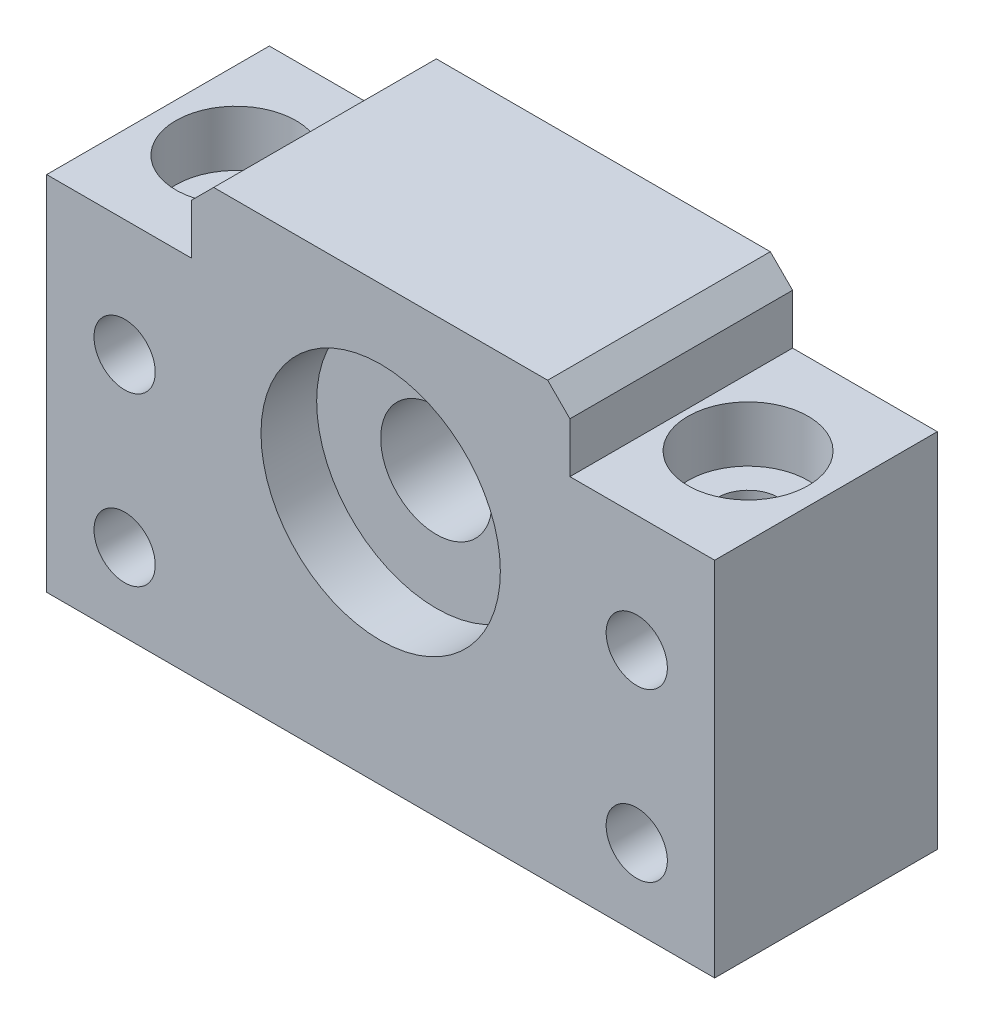
ISO-10303-21;
HEADER;
FILE_DESCRIPTION(('STEP AP214'),'2;1');
FILE_NAME('part.step','',(''),(''),'','','');
FILE_SCHEMA(('AUTOMOTIVE_DESIGN { 1 0 10303 214 1 1 1 1 }'));
ENDSEC;
DATA;
#1=APPLICATION_CONTEXT('core data for automotive mechanical design processes');
#2=APPLICATION_PROTOCOL_DEFINITION('international standard','automotive_design',2000,#1);
#3=PRODUCT_CONTEXT('',#1,'mechanical');
#4=PRODUCT('Part','Part','',(#3));
#5=PRODUCT_RELATED_PRODUCT_CATEGORY('part','',(#4));
#6=PRODUCT_DEFINITION_FORMATION('','',#4);
#7=PRODUCT_DEFINITION_CONTEXT('part definition',#1,'design');
#8=PRODUCT_DEFINITION('design','',#6,#7);
#9=PRODUCT_DEFINITION_SHAPE('','',#8);
#10=(LENGTH_UNIT() NAMED_UNIT(*) SI_UNIT(.MILLI.,.METRE.));
#11=(NAMED_UNIT(*) PLANE_ANGLE_UNIT() SI_UNIT($,.RADIAN.));
#12=(NAMED_UNIT(*) SI_UNIT($,.STERADIAN.) SOLID_ANGLE_UNIT());
#13=UNCERTAINTY_MEASURE_WITH_UNIT(LENGTH_MEASURE(1.E-05),#10,'distance_accuracy_value','');
#14=(GEOMETRIC_REPRESENTATION_CONTEXT(3) GLOBAL_UNCERTAINTY_ASSIGNED_CONTEXT((#13)) GLOBAL_UNIT_ASSIGNED_CONTEXT((#10,
#11,#12)) REPRESENTATION_CONTEXT('',''));
#15=CARTESIAN_POINT('',(0.,0.,0.));
#16=DIRECTION('',(0.,0.,1.));
#17=DIRECTION('',(1.,0.,0.));
#18=AXIS2_PLACEMENT_3D('',#15,#16,#17);
#19=CARTESIAN_POINT('',(0.,0.,5.));
#20=DIRECTION('',(0.,0.,1.));
#21=DIRECTION('',(1.,0.,0.));
#22=AXIS2_PLACEMENT_3D('',#19,#20,#21);
#23=PLANE('',#22);
#24=CARTESIAN_POINT('',(0.,0.,5.));
#25=DIRECTION('',(0.,0.,1.));
#26=DIRECTION('',(1.,0.,0.));
#27=AXIS2_PLACEMENT_3D('',#24,#25,#26);
#28=CIRCLE('',#27,10.75);
#29=CARTESIAN_POINT('',(10.75,0.,5.));
#30=VERTEX_POINT('',#29);
#31=EDGE_CURVE('E11',#30,#30,#28,.T.);
#32=ORIENTED_EDGE('',*,*,#31,.T.);
#33=EDGE_LOOP('',(#32));
#34=FACE_BOUND('',#33,.T.);
#35=CARTESIAN_POINT('',(0.,0.,5.));
#36=DIRECTION('',(0.,0.,1.));
#37=DIRECTION('',(1.,0.,0.));
#38=AXIS2_PLACEMENT_3D('',#35,#36,#37);
#39=CIRCLE('',#38,5.);
#40=CARTESIAN_POINT('',(5.,0.,5.));
#41=VERTEX_POINT('',#40);
#42=EDGE_CURVE('E60',#41,#41,#39,.T.);
#43=ORIENTED_EDGE('',*,*,#42,.F.);
#44=EDGE_LOOP('',(#43));
#45=FACE_BOUND('',#44,.T.);
#46=ADVANCED_FACE('F49',(#34,#45),#23,.T.);
#47=CARTESIAN_POINT('',(0.,0.,-5.));
#48=DIRECTION('',(0.,0.,1.));
#49=DIRECTION('',(1.,0.,0.));
#50=AXIS2_PLACEMENT_3D('',#47,#48,#49);
#51=PLANE('',#50);
#52=CARTESIAN_POINT('',(0.,0.,-5.));
#53=DIRECTION('',(0.,0.,1.));
#54=DIRECTION('',(1.,0.,0.));
#55=AXIS2_PLACEMENT_3D('',#52,#53,#54);
#56=CIRCLE('',#55,10.75);
#57=CARTESIAN_POINT('',(10.75,0.,-5.));
#58=VERTEX_POINT('',#57);
#59=EDGE_CURVE('E53',#58,#58,#56,.T.);
#60=ORIENTED_EDGE('',*,*,#59,.F.);
#61=EDGE_LOOP('',(#60));
#62=FACE_BOUND('',#61,.T.);
#63=CARTESIAN_POINT('',(0.,0.,-5.));
#64=DIRECTION('',(0.,0.,1.));
#65=DIRECTION('',(1.,0.,0.));
#66=AXIS2_PLACEMENT_3D('',#63,#64,#65);
#67=CIRCLE('',#66,5.);
#68=CARTESIAN_POINT('',(5.,0.,-5.));
#69=VERTEX_POINT('',#68);
#70=EDGE_CURVE('E62',#69,#69,#67,.T.);
#71=ORIENTED_EDGE('',*,*,#70,.T.);
#72=EDGE_LOOP('',(#71));
#73=FACE_BOUND('',#72,.T.);
#74=ADVANCED_FACE('F72',(#62,#73),#51,.F.);
#75=CARTESIAN_POINT('',(0.,0.,5.));
#76=DIRECTION('',(0.,0.,-1.));
#77=DIRECTION('',(-1.,0.,0.));
#78=AXIS2_PLACEMENT_3D('',#75,#76,#77);
#79=CYLINDRICAL_SURFACE('',#78,10.75);
#80=ORIENTED_EDGE('',*,*,#31,.F.);
#81=EDGE_LOOP('',(#80));
#82=FACE_BOUND('',#81,.T.);
#83=ORIENTED_EDGE('',*,*,#59,.T.);
#84=EDGE_LOOP('',(#83));
#85=FACE_BOUND('',#84,.T.);
#86=ADVANCED_FACE('F51',(#82,#85),#79,.T.);
#87=CARTESIAN_POINT('',(0.,0.,5.));
#88=DIRECTION('',(0.,0.,-1.));
#89=DIRECTION('',(-1.,0.,0.));
#90=AXIS2_PLACEMENT_3D('',#87,#88,#89);
#91=CYLINDRICAL_SURFACE('',#90,5.);
#92=ORIENTED_EDGE('',*,*,#42,.T.);
#93=EDGE_LOOP('',(#92));
#94=FACE_BOUND('',#93,.T.);
#95=ORIENTED_EDGE('',*,*,#70,.F.);
#96=EDGE_LOOP('',(#95));
#97=FACE_BOUND('',#96,.T.);
#98=ADVANCED_FACE('F68',(#94,#97),#91,.F.);
#99=CLOSED_SHELL('',(#46,#74,#86,#98));
#100=MANIFOLD_SOLID_BREP('B2',#99);
#101=CARTESIAN_POINT('',(23.,17.,0.));
#102=DIRECTION('',(0.,-1.,0.));
#103=DIRECTION('',(1.,0.,0.));
#104=AXIS2_PLACEMENT_3D('',#101,#102,#103);
#105=CYLINDRICAL_SURFACE('',#104,2.75);
#106=CARTESIAN_POINT('',(23.,0.,0.));
#107=DIRECTION('',(0.,-0.707106781186547,-0.707106781186547));
#108=DIRECTION('',(0.,0.707106781186547,-0.707106781186547));
#109=AXIS2_PLACEMENT_3D('',#106,#107,#108);
#110=ELLIPSE('',#109,3.88908729652601,2.75);
#111=CARTESIAN_POINT('',(20.25,0.,0.));
#112=VERTEX_POINT('',#111);
#113=CARTESIAN_POINT('',(25.75,0.,0.));
#114=VERTEX_POINT('',#113);
#115=EDGE_CURVE('E225',#112,#114,#110,.T.);
#116=ORIENTED_EDGE('',*,*,#115,.T.);
#117=CARTESIAN_POINT('',(23.,0.,0.));
#118=DIRECTION('',(0.,0.707106781186547,-0.707106781186547));
#119=DIRECTION('',(0.,-0.707106781186547,-0.707106781186547));
#120=AXIS2_PLACEMENT_3D('',#117,#118,#119);
#121=ELLIPSE('',#120,3.88908729652601,2.75);
#122=EDGE_CURVE('E226',#114,#112,#121,.F.);
#123=ORIENTED_EDGE('',*,*,#122,.T.);
#124=EDGE_LOOP('',(#116,#123));
#125=FACE_BOUND('',#124,.T.);
#126=CARTESIAN_POINT('',(23.,5.49999999999998,0.));
#127=DIRECTION('',(0.,1.,0.));
#128=DIRECTION('',(-1.,0.,0.));
#129=AXIS2_PLACEMENT_3D('',#126,#127,#128);
#130=CIRCLE('',#129,2.75);
#131=CARTESIAN_POINT('',(20.25,5.49999999999998,0.));
#132=VERTEX_POINT('',#131);
#133=EDGE_CURVE('E115',#132,#132,#130,.F.);
#134=ORIENTED_EDGE('',*,*,#133,.F.);
#135=EDGE_LOOP('',(#134));
#136=FACE_BOUND('',#135,.T.);
#137=ADVANCED_FACE('F111',(#125,#136),#105,.F.);
#138=CARTESIAN_POINT('',(-23.,17.,0.));
#139=DIRECTION('',(0.,-1.,0.));
#140=DIRECTION('',(1.,0.,0.));
#141=AXIS2_PLACEMENT_3D('',#138,#139,#140);
#142=CYLINDRICAL_SURFACE('',#141,2.75);
#143=CARTESIAN_POINT('',(-23.,0.,0.));
#144=DIRECTION('',(0.,-0.707106781186547,-0.707106781186547));
#145=DIRECTION('',(0.,0.707106781186547,-0.707106781186547));
#146=AXIS2_PLACEMENT_3D('',#143,#144,#145);
#147=ELLIPSE('',#146,3.88908729652601,2.75);
#148=CARTESIAN_POINT('',(-25.75,0.,0.));
#149=VERTEX_POINT('',#148);
#150=CARTESIAN_POINT('',(-20.25,0.,0.));
#151=VERTEX_POINT('',#150);
#152=EDGE_CURVE('E304',#149,#151,#147,.T.);
#153=ORIENTED_EDGE('',*,*,#152,.T.);
#154=CARTESIAN_POINT('',(-23.,0.,0.));
#155=DIRECTION('',(0.,0.707106781186547,-0.707106781186547));
#156=DIRECTION('',(0.,-0.707106781186547,-0.707106781186547));
#157=AXIS2_PLACEMENT_3D('',#154,#155,#156);
#158=ELLIPSE('',#157,3.88908729652601,2.75);
#159=EDGE_CURVE('E128',#151,#149,#158,.F.);
#160=ORIENTED_EDGE('',*,*,#159,.T.);
#161=EDGE_LOOP('',(#153,#160));
#162=FACE_BOUND('',#161,.T.);
#163=CARTESIAN_POINT('',(-23.,5.49999999999999,0.));
#164=DIRECTION('',(0.,1.,0.));
#165=DIRECTION('',(-1.,0.,0.));
#166=AXIS2_PLACEMENT_3D('',#163,#164,#165);
#167=CIRCLE('',#166,2.75);
#168=CARTESIAN_POINT('',(-25.75,5.49999999999999,0.));
#169=VERTEX_POINT('',#168);
#170=EDGE_CURVE('E250',#169,#169,#167,.F.);
#171=ORIENTED_EDGE('',*,*,#170,.F.);
#172=EDGE_LOOP('',(#171));
#173=FACE_BOUND('',#172,.T.);
#174=ADVANCED_FACE('F515',(#162,#173),#142,.F.);
#175=CARTESIAN_POINT('',(-23.,0.,10.));
#176=DIRECTION('',(0.,0.,-1.));
#177=DIRECTION('',(-1.,0.,0.));
#178=AXIS2_PLACEMENT_3D('',#175,#176,#177);
#179=CYLINDRICAL_SURFACE('',#178,2.75);
#180=CARTESIAN_POINT('',(-23.,0.,0.));
#181=DIRECTION('',(0.,-0.707106781186547,-0.707106781186547));
#182=DIRECTION('',(0.,0.707106781186547,-0.707106781186547));
#183=AXIS2_PLACEMENT_3D('',#180,#181,#182);
#184=ELLIPSE('',#183,3.88908729652601,2.75);
#185=EDGE_CURVE('E307',#149,#151,#184,.F.);
#186=ORIENTED_EDGE('',*,*,#185,.F.);
#187=ORIENTED_EDGE('',*,*,#159,.F.);
#188=EDGE_LOOP('',(#186,#187));
#189=FACE_BOUND('',#188,.T.);
#190=CARTESIAN_POINT('',(-23.,0.,10.));
#191=DIRECTION('',(0.,0.,1.));
#192=DIRECTION('',(1.,0.,0.));
#193=AXIS2_PLACEMENT_3D('',#190,#191,#192);
#194=CIRCLE('',#193,2.75);
#195=CARTESIAN_POINT('',(-20.25,0.,10.));
#196=VERTEX_POINT('',#195);
#197=EDGE_CURVE('E336',#196,#196,#194,.T.);
#198=ORIENTED_EDGE('',*,*,#197,.T.);
#199=EDGE_LOOP('',(#198));
#200=FACE_BOUND('',#199,.T.);
#201=ADVANCED_FACE('F521',(#189,#200),#179,.F.);
#202=CARTESIAN_POINT('',(-23.,-15.,10.));
#203=DIRECTION('',(0.,0.,-1.));
#204=DIRECTION('',(-1.,0.,0.));
#205=AXIS2_PLACEMENT_3D('',#202,#203,#204);
#206=CYLINDRICAL_SURFACE('',#205,2.75);
#207=CARTESIAN_POINT('',(-23.,-15.,0.));
#208=DIRECTION('',(0.,-0.707106781186547,-0.707106781186547));
#209=DIRECTION('',(0.,0.707106781186547,-0.707106781186547));
#210=AXIS2_PLACEMENT_3D('',#207,#208,#209);
#211=ELLIPSE('',#210,3.88908729652601,2.75);
#212=CARTESIAN_POINT('',(-25.75,-15.,0.));
#213=VERTEX_POINT('',#212);
#214=CARTESIAN_POINT('',(-20.25,-15.,0.));
#215=VERTEX_POINT('',#214);
#216=EDGE_CURVE('E47',#213,#215,#211,.F.);
#217=ORIENTED_EDGE('',*,*,#216,.F.);
#218=CARTESIAN_POINT('',(-23.,-15.,0.));
#219=DIRECTION('',(0.,0.707106781186547,-0.707106781186547));
#220=DIRECTION('',(0.,-0.707106781186547,-0.707106781186547));
#221=AXIS2_PLACEMENT_3D('',#218,#219,#220);
#222=ELLIPSE('',#221,3.88908729652601,2.75);
#223=EDGE_CURVE('E135',#215,#213,#222,.F.);
#224=ORIENTED_EDGE('',*,*,#223,.F.);
#225=EDGE_LOOP('',(#217,#224));
#226=FACE_BOUND('',#225,.T.);
#227=CARTESIAN_POINT('',(-23.,-15.,10.));
#228=DIRECTION('',(0.,0.,1.));
#229=DIRECTION('',(1.,0.,0.));
#230=AXIS2_PLACEMENT_3D('',#227,#228,#229);
#231=CIRCLE('',#230,2.75);
#232=CARTESIAN_POINT('',(-20.25,-15.,10.));
#233=VERTEX_POINT('',#232);
#234=EDGE_CURVE('E328',#233,#233,#231,.T.);
#235=ORIENTED_EDGE('',*,*,#234,.T.);
#236=EDGE_LOOP('',(#235));
#237=FACE_BOUND('',#236,.T.);
#238=ADVANCED_FACE('F572',(#226,#237),#206,.F.);
#239=CARTESIAN_POINT('',(23.,-15.,10.));
#240=DIRECTION('',(0.,0.,-1.));
#241=DIRECTION('',(-1.,0.,0.));
#242=AXIS2_PLACEMENT_3D('',#239,#240,#241);
#243=CYLINDRICAL_SURFACE('',#242,2.75);
#244=CARTESIAN_POINT('',(23.,-15.,0.));
#245=DIRECTION('',(0.,-0.707106781186547,-0.707106781186547));
#246=DIRECTION('',(0.,0.707106781186547,-0.707106781186547));
#247=AXIS2_PLACEMENT_3D('',#244,#245,#246);
#248=ELLIPSE('',#247,3.88908729652601,2.75);
#249=CARTESIAN_POINT('',(20.25,-15.,0.));
#250=VERTEX_POINT('',#249);
#251=CARTESIAN_POINT('',(25.75,-15.,0.));
#252=VERTEX_POINT('',#251);
#253=EDGE_CURVE('E295',#250,#252,#248,.F.);
#254=ORIENTED_EDGE('',*,*,#253,.F.);
#255=CARTESIAN_POINT('',(23.,-15.,0.));
#256=DIRECTION('',(0.,0.707106781186547,-0.707106781186547));
#257=DIRECTION('',(0.,-0.707106781186547,-0.707106781186547));
#258=AXIS2_PLACEMENT_3D('',#255,#256,#257);
#259=ELLIPSE('',#258,3.88908729652601,2.75);
#260=EDGE_CURVE('E281',#252,#250,#259,.F.);
#261=ORIENTED_EDGE('',*,*,#260,.F.);
#262=EDGE_LOOP('',(#254,#261));
#263=FACE_BOUND('',#262,.T.);
#264=CARTESIAN_POINT('',(23.,-15.,10.));
#265=DIRECTION('',(0.,0.,1.));
#266=DIRECTION('',(-1.,0.,0.));
#267=AXIS2_PLACEMENT_3D('',#264,#265,#266);
#268=CIRCLE('',#267,2.75);
#269=CARTESIAN_POINT('',(20.25,-15.,10.));
#270=VERTEX_POINT('',#269);
#271=EDGE_CURVE('E320',#270,#270,#268,.T.);
#272=ORIENTED_EDGE('',*,*,#271,.T.);
#273=EDGE_LOOP('',(#272));
#274=FACE_BOUND('',#273,.T.);
#275=ADVANCED_FACE('F575',(#263,#274),#243,.F.);
#276=CARTESIAN_POINT('',(23.,0.,10.));
#277=DIRECTION('',(0.,0.,-1.));
#278=DIRECTION('',(-1.,0.,0.));
#279=AXIS2_PLACEMENT_3D('',#276,#277,#278);
#280=CYLINDRICAL_SURFACE('',#279,2.75);
#281=CARTESIAN_POINT('',(23.,0.,0.));
#282=DIRECTION('',(0.,-0.707106781186547,-0.707106781186547));
#283=DIRECTION('',(0.,0.707106781186547,-0.707106781186547));
#284=AXIS2_PLACEMENT_3D('',#281,#282,#283);
#285=ELLIPSE('',#284,3.88908729652601,2.75);
#286=EDGE_CURVE('E221',#112,#114,#285,.F.);
#287=ORIENTED_EDGE('',*,*,#286,.F.);
#288=ORIENTED_EDGE('',*,*,#122,.F.);
#289=EDGE_LOOP('',(#287,#288));
#290=FACE_BOUND('',#289,.T.);
#291=CARTESIAN_POINT('',(23.,0.,10.));
#292=DIRECTION('',(0.,0.,1.));
#293=DIRECTION('',(-1.,0.,0.));
#294=AXIS2_PLACEMENT_3D('',#291,#292,#293);
#295=CIRCLE('',#294,2.75);
#296=CARTESIAN_POINT('',(20.25,0.,10.));
#297=VERTEX_POINT('',#296);
#298=EDGE_CURVE('E312',#297,#297,#295,.T.);
#299=ORIENTED_EDGE('',*,*,#298,.T.);
#300=EDGE_LOOP('',(#299));
#301=FACE_BOUND('',#300,.T.);
#302=ADVANCED_FACE('F235',(#290,#301),#280,.F.);
#303=CARTESIAN_POINT('',(0.,0.,10.));
#304=DIRECTION('',(0.,0.,-1.));
#305=DIRECTION('',(-1.,0.,0.));
#306=AXIS2_PLACEMENT_3D('',#303,#304,#305);
#307=PLANE('',#306);
#308=DIRECTION('',(-0.707106781186551,0.707106781186543,0.));
#309=VECTOR('',#308,1.);
#310=CARTESIAN_POINT('',(15.,17.,10.));
#311=LINE('',#310,#309);
#312=CARTESIAN_POINT('',(17.,15.,10.));
#313=VERTEX_POINT('',#312);
#314=CARTESIAN_POINT('',(15.,17.,10.));
#315=VERTEX_POINT('',#314);
#316=EDGE_CURVE('E352',#313,#315,#311,.T.);
#317=ORIENTED_EDGE('',*,*,#316,.T.);
#318=DIRECTION('',(-1.,0.,0.));
#319=VECTOR('',#318,1.);
#320=CARTESIAN_POINT('',(15.,17.,10.));
#321=LINE('',#320,#319);
#322=CARTESIAN_POINT('',(-15.,17.,10.));
#323=VERTEX_POINT('',#322);
#324=EDGE_CURVE('E356',#315,#323,#321,.T.);
#325=ORIENTED_EDGE('',*,*,#324,.T.);
#326=DIRECTION('',(-0.707106781186551,-0.707106781186544,0.));
#327=VECTOR('',#326,1.);
#328=CARTESIAN_POINT('',(-15.,17.,10.));
#329=LINE('',#328,#327);
#330=CARTESIAN_POINT('',(-17.,15.,10.));
#331=VERTEX_POINT('',#330);
#332=EDGE_CURVE('E360',#323,#331,#329,.T.);
#333=ORIENTED_EDGE('',*,*,#332,.T.);
#334=DIRECTION('',(0.,-1.,0.));
#335=VECTOR('',#334,1.);
#336=CARTESIAN_POINT('',(-17.,15.,10.));
#337=LINE('',#336,#335);
#338=CARTESIAN_POINT('',(-17.,10.5,10.));
#339=VERTEX_POINT('',#338);
#340=EDGE_CURVE('E363',#331,#339,#337,.T.);
#341=ORIENTED_EDGE('',*,*,#340,.T.);
#342=DIRECTION('',(-1.,0.,0.));
#343=VECTOR('',#342,1.);
#344=CARTESIAN_POINT('',(-17.,10.5,10.));
#345=LINE('',#344,#343);
#346=CARTESIAN_POINT('',(-30.,10.5,10.));
#347=VERTEX_POINT('',#346);
#348=EDGE_CURVE('E366',#339,#347,#345,.T.);
#349=ORIENTED_EDGE('',*,*,#348,.T.);
#350=DIRECTION('',(0.,-1.,0.));
#351=VECTOR('',#350,1.);
#352=CARTESIAN_POINT('',(-30.,10.5,10.));
#353=LINE('',#352,#351);
#354=CARTESIAN_POINT('',(-30.,-22.,10.));
#355=VERTEX_POINT('',#354);
#356=EDGE_CURVE('E369',#347,#355,#353,.T.);
#357=ORIENTED_EDGE('',*,*,#356,.T.);
#358=DIRECTION('',(1.,0.,0.));
#359=VECTOR('',#358,1.);
#360=CARTESIAN_POINT('',(-30.,-22.,10.));
#361=LINE('',#360,#359);
#362=CARTESIAN_POINT('',(30.,-22.,10.));
#363=VERTEX_POINT('',#362);
#364=EDGE_CURVE('E372',#355,#363,#361,.T.);
#365=ORIENTED_EDGE('',*,*,#364,.T.);
#366=DIRECTION('',(0.,1.,0.));
#367=VECTOR('',#366,1.);
#368=CARTESIAN_POINT('',(30.,10.5,10.));
#369=LINE('',#368,#367);
#370=CARTESIAN_POINT('',(30.,10.5,10.));
#371=VERTEX_POINT('',#370);
#372=EDGE_CURVE('E375',#363,#371,#369,.T.);
#373=ORIENTED_EDGE('',*,*,#372,.T.);
#374=DIRECTION('',(-1.,0.,0.));
#375=VECTOR('',#374,1.);
#376=CARTESIAN_POINT('',(17.,10.5,10.));
#377=LINE('',#376,#375);
#378=CARTESIAN_POINT('',(17.,10.5,10.));
#379=VERTEX_POINT('',#378);
#380=EDGE_CURVE('E378',#371,#379,#377,.T.);
#381=ORIENTED_EDGE('',*,*,#380,.T.);
#382=DIRECTION('',(0.,1.,0.));
#383=VECTOR('',#382,1.);
#384=CARTESIAN_POINT('',(17.,15.,10.));
#385=LINE('',#384,#383);
#386=EDGE_CURVE('E381',#379,#313,#385,.T.);
#387=ORIENTED_EDGE('',*,*,#386,.T.);
#388=EDGE_LOOP('',(#317,#325,#333,#341,#349,#357,#365,#373,#381,#387));
#389=FACE_BOUND('',#388,.T.);
#390=CARTESIAN_POINT('',(0.,0.,10.));
#391=DIRECTION('',(0.,0.,1.));
#392=DIRECTION('',(1.,0.,0.));
#393=AXIS2_PLACEMENT_3D('',#390,#391,#392);
#394=CIRCLE('',#393,10.75);
#395=CARTESIAN_POINT('',(10.75,0.,10.));
#396=VERTEX_POINT('',#395);
#397=EDGE_CURVE('E344',#396,#396,#394,.T.);
#398=ORIENTED_EDGE('',*,*,#397,.F.);
#399=EDGE_LOOP('',(#398));
#400=FACE_BOUND('',#399,.T.);
#401=ORIENTED_EDGE('',*,*,#197,.F.);
#402=EDGE_LOOP('',(#401));
#403=FACE_BOUND('',#402,.T.);
#404=ORIENTED_EDGE('',*,*,#234,.F.);
#405=EDGE_LOOP('',(#404));
#406=FACE_BOUND('',#405,.T.);
#407=ORIENTED_EDGE('',*,*,#271,.F.);
#408=EDGE_LOOP('',(#407));
#409=FACE_BOUND('',#408,.T.);
#410=ORIENTED_EDGE('',*,*,#298,.F.);
#411=EDGE_LOOP('',(#410));
#412=FACE_BOUND('',#411,.T.);
#413=ADVANCED_FACE('F477',(#389,#400,#403,#406,#409,#412),#307,.F.);
#414=CARTESIAN_POINT('',(0.,0.,-10.));
#415=DIRECTION('',(0.,0.,-1.));
#416=DIRECTION('',(-1.,0.,0.));
#417=AXIS2_PLACEMENT_3D('',#414,#415,#416);
#418=PLANE('',#417);
#419=CARTESIAN_POINT('',(23.,-15.,-10.));
#420=DIRECTION('',(0.,0.,1.));
#421=DIRECTION('',(-1.,0.,0.));
#422=AXIS2_PLACEMENT_3D('',#419,#420,#421);
#423=CIRCLE('',#422,2.75);
#424=CARTESIAN_POINT('',(20.25,-15.,-10.));
#425=VERTEX_POINT('',#424);
#426=EDGE_CURVE('E316',#425,#425,#423,.T.);
#427=ORIENTED_EDGE('',*,*,#426,.T.);
#428=EDGE_LOOP('',(#427));
#429=FACE_BOUND('',#428,.T.);
#430=CARTESIAN_POINT('',(-23.,0.,-10.));
#431=DIRECTION('',(0.,0.,1.));
#432=DIRECTION('',(1.,0.,0.));
#433=AXIS2_PLACEMENT_3D('',#430,#431,#432);
#434=CIRCLE('',#433,2.75);
#435=CARTESIAN_POINT('',(-20.25,0.,-10.));
#436=VERTEX_POINT('',#435);
#437=EDGE_CURVE('E332',#436,#436,#434,.T.);
#438=ORIENTED_EDGE('',*,*,#437,.T.);
#439=EDGE_LOOP('',(#438));
#440=FACE_BOUND('',#439,.T.);
#441=DIRECTION('',(-0.707106781186551,0.707106781186543,0.));
#442=VECTOR('',#441,1.);
#443=CARTESIAN_POINT('',(15.,17.,-10.));
#444=LINE('',#443,#442);
#445=CARTESIAN_POINT('',(17.,15.,-10.));
#446=VERTEX_POINT('',#445);
#447=CARTESIAN_POINT('',(15.,17.,-10.));
#448=VERTEX_POINT('',#447);
#449=EDGE_CURVE('E348',#446,#448,#444,.T.);
#450=ORIENTED_EDGE('',*,*,#449,.F.);
#451=DIRECTION('',(0.,1.,0.));
#452=VECTOR('',#451,1.);
#453=CARTESIAN_POINT('',(17.,15.,-10.));
#454=LINE('',#453,#452);
#455=CARTESIAN_POINT('',(17.,10.5,-10.));
#456=VERTEX_POINT('',#455);
#457=EDGE_CURVE('E357',#456,#446,#454,.T.);
#458=ORIENTED_EDGE('',*,*,#457,.F.);
#459=DIRECTION('',(-1.,0.,0.));
#460=VECTOR('',#459,1.);
#461=CARTESIAN_POINT('',(17.,10.5,-10.));
#462=LINE('',#461,#460);
#463=CARTESIAN_POINT('',(30.,10.5,-10.));
#464=VERTEX_POINT('',#463);
#465=EDGE_CURVE('E409',#464,#456,#462,.T.);
#466=ORIENTED_EDGE('',*,*,#465,.F.);
#467=DIRECTION('',(0.,1.,0.));
#468=VECTOR('',#467,1.);
#469=CARTESIAN_POINT('',(30.,10.5,-10.));
#470=LINE('',#469,#468);
#471=CARTESIAN_POINT('',(30.,-22.,-10.));
#472=VERTEX_POINT('',#471);
#473=EDGE_CURVE('E406',#472,#464,#470,.T.);
#474=ORIENTED_EDGE('',*,*,#473,.F.);
#475=DIRECTION('',(1.,0.,0.));
#476=VECTOR('',#475,1.);
#477=CARTESIAN_POINT('',(-30.,-22.,-10.));
#478=LINE('',#477,#476);
#479=CARTESIAN_POINT('',(-30.,-22.,-10.));
#480=VERTEX_POINT('',#479);
#481=EDGE_CURVE('E403',#480,#472,#478,.T.);
#482=ORIENTED_EDGE('',*,*,#481,.F.);
#483=DIRECTION('',(0.,-1.,0.));
#484=VECTOR('',#483,1.);
#485=CARTESIAN_POINT('',(-30.,10.5,-10.));
#486=LINE('',#485,#484);
#487=CARTESIAN_POINT('',(-30.,10.5,-10.));
#488=VERTEX_POINT('',#487);
#489=EDGE_CURVE('E400',#488,#480,#486,.T.);
#490=ORIENTED_EDGE('',*,*,#489,.F.);
#491=DIRECTION('',(-1.,0.,0.));
#492=VECTOR('',#491,1.);
#493=CARTESIAN_POINT('',(-17.,10.5,-10.));
#494=LINE('',#493,#492);
#495=CARTESIAN_POINT('',(-17.,10.5,-10.));
#496=VERTEX_POINT('',#495);
#497=EDGE_CURVE('E397',#496,#488,#494,.T.);
#498=ORIENTED_EDGE('',*,*,#497,.F.);
#499=DIRECTION('',(0.,-1.,0.));
#500=VECTOR('',#499,1.);
#501=CARTESIAN_POINT('',(-17.,15.,-10.));
#502=LINE('',#501,#500);
#503=CARTESIAN_POINT('',(-17.,15.,-10.));
#504=VERTEX_POINT('',#503);
#505=EDGE_CURVE('E394',#504,#496,#502,.T.);
#506=ORIENTED_EDGE('',*,*,#505,.F.);
#507=DIRECTION('',(-0.707106781186551,-0.707106781186544,0.));
#508=VECTOR('',#507,1.);
#509=CARTESIAN_POINT('',(-15.,17.,-10.));
#510=LINE('',#509,#508);
#511=CARTESIAN_POINT('',(-15.,17.,-10.));
#512=VERTEX_POINT('',#511);
#513=EDGE_CURVE('E391',#512,#504,#510,.T.);
#514=ORIENTED_EDGE('',*,*,#513,.F.);
#515=DIRECTION('',(-1.,0.,0.));
#516=VECTOR('',#515,1.);
#517=CARTESIAN_POINT('',(15.,17.,-10.));
#518=LINE('',#517,#516);
#519=EDGE_CURVE('E388',#448,#512,#518,.T.);
#520=ORIENTED_EDGE('',*,*,#519,.F.);
#521=EDGE_LOOP('',(#450,#458,#466,#474,#482,#490,#498,#506,#514,#520));
#522=FACE_BOUND('',#521,.T.);
#523=CARTESIAN_POINT('',(0.,0.,-10.));
#524=DIRECTION('',(0.,0.,1.));
#525=DIRECTION('',(1.,0.,0.));
#526=AXIS2_PLACEMENT_3D('',#523,#524,#525);
#527=CIRCLE('',#526,10.75);
#528=CARTESIAN_POINT('',(10.75,0.,-10.));
#529=VERTEX_POINT('',#528);
#530=EDGE_CURVE('E340',#529,#529,#527,.T.);
#531=ORIENTED_EDGE('',*,*,#530,.T.);
#532=EDGE_LOOP('',(#531));
#533=FACE_BOUND('',#532,.T.);
#534=CARTESIAN_POINT('',(-23.,-15.,-10.));
#535=DIRECTION('',(0.,0.,1.));
#536=DIRECTION('',(1.,0.,0.));
#537=AXIS2_PLACEMENT_3D('',#534,#535,#536);
#538=CIRCLE('',#537,2.75);
#539=CARTESIAN_POINT('',(-20.25,-15.,-10.));
#540=VERTEX_POINT('',#539);
#541=EDGE_CURVE('E324',#540,#540,#538,.T.);
#542=ORIENTED_EDGE('',*,*,#541,.T.);
#543=EDGE_LOOP('',(#542));
#544=FACE_BOUND('',#543,.T.);
#545=CARTESIAN_POINT('',(23.,0.,-10.));
#546=DIRECTION('',(0.,0.,1.));
#547=DIRECTION('',(-1.,0.,0.));
#548=AXIS2_PLACEMENT_3D('',#545,#546,#547);
#549=CIRCLE('',#548,2.75);
#550=CARTESIAN_POINT('',(20.25,0.,-10.));
#551=VERTEX_POINT('',#550);
#552=EDGE_CURVE('E311',#551,#551,#549,.T.);
#553=ORIENTED_EDGE('',*,*,#552,.T.);
#554=EDGE_LOOP('',(#553));
#555=FACE_BOUND('',#554,.T.);
#556=ADVANCED_FACE('F461',(#429,#440,#522,#533,#544,#555),#418,.T.);
#557=CARTESIAN_POINT('',(15.,17.,10.));
#558=DIRECTION('',(-0.707106781186544,-0.707106781186552,0.));
#559=DIRECTION('',(0.707106781186552,-0.707106781186544,0.));
#560=AXIS2_PLACEMENT_3D('',#557,#558,#559);
#561=PLANE('',#560);
#562=ORIENTED_EDGE('',*,*,#449,.T.);
#563=DIRECTION('',(0.,0.,-1.));
#564=VECTOR('',#563,1.);
#565=CARTESIAN_POINT('',(15.,17.,10.));
#566=LINE('',#565,#564);
#567=EDGE_CURVE('E233',#315,#448,#566,.T.);
#568=ORIENTED_EDGE('',*,*,#567,.F.);
#569=ORIENTED_EDGE('',*,*,#316,.F.);
#570=DIRECTION('',(0.,0.,-1.));
#571=VECTOR('',#570,1.);
#572=CARTESIAN_POINT('',(17.,15.,10.));
#573=LINE('',#572,#571);
#574=EDGE_CURVE('E384',#313,#446,#573,.T.);
#575=ORIENTED_EDGE('',*,*,#574,.T.);
#576=EDGE_LOOP('',(#562,#568,#569,#575));
#577=FACE_BOUND('',#576,.T.);
#578=ADVANCED_FACE('F113',(#577),#561,.F.);
#579=CARTESIAN_POINT('',(15.,17.,10.));
#580=DIRECTION('',(0.,-1.,0.));
#581=DIRECTION('',(0.,0.,-1.));
#582=AXIS2_PLACEMENT_3D('',#579,#580,#581);
#583=PLANE('',#582);
#584=ORIENTED_EDGE('',*,*,#519,.T.);
#585=DIRECTION('',(0.,0.,-1.));
#586=VECTOR('',#585,1.);
#587=CARTESIAN_POINT('',(-15.,17.,10.));
#588=LINE('',#587,#586);
#589=EDGE_CURVE('E445',#323,#512,#588,.T.);
#590=ORIENTED_EDGE('',*,*,#589,.F.);
#591=ORIENTED_EDGE('',*,*,#324,.F.);
#592=ORIENTED_EDGE('',*,*,#567,.T.);
#593=EDGE_LOOP('',(#584,#590,#591,#592));
#594=FACE_BOUND('',#593,.T.);
#595=ADVANCED_FACE('F453',(#594),#583,.F.);
#596=CARTESIAN_POINT('',(-15.,17.,10.));
#597=DIRECTION('',(0.707106781186544,-0.707106781186551,0.));
#598=DIRECTION('',(0.707106781186551,0.707106781186544,0.));
#599=AXIS2_PLACEMENT_3D('',#596,#597,#598);
#600=PLANE('',#599);
#601=ORIENTED_EDGE('',*,*,#513,.T.);
#602=DIRECTION('',(0.,0.,-1.));
#603=VECTOR('',#602,1.);
#604=CARTESIAN_POINT('',(-17.,15.,10.));
#605=LINE('',#604,#603);
#606=EDGE_CURVE('E441',#331,#504,#605,.T.);
#607=ORIENTED_EDGE('',*,*,#606,.F.);
#608=ORIENTED_EDGE('',*,*,#332,.F.);
#609=ORIENTED_EDGE('',*,*,#589,.T.);
#610=EDGE_LOOP('',(#601,#607,#608,#609));
#611=FACE_BOUND('',#610,.T.);
#612=ADVANCED_FACE('F469',(#611),#600,.F.);
#613=CARTESIAN_POINT('',(-17.,15.,10.));
#614=DIRECTION('',(1.,0.,0.));
#615=DIRECTION('',(0.,0.,-1.));
#616=AXIS2_PLACEMENT_3D('',#613,#614,#615);
#617=PLANE('',#616);
#618=ORIENTED_EDGE('',*,*,#505,.T.);
#619=DIRECTION('',(0.,0.,-1.));
#620=VECTOR('',#619,1.);
#621=CARTESIAN_POINT('',(-17.,10.5,10.));
#622=LINE('',#621,#620);
#623=EDGE_CURVE('E437',#339,#496,#622,.T.);
#624=ORIENTED_EDGE('',*,*,#623,.F.);
#625=ORIENTED_EDGE('',*,*,#340,.F.);
#626=ORIENTED_EDGE('',*,*,#606,.T.);
#627=EDGE_LOOP('',(#618,#624,#625,#626));
#628=FACE_BOUND('',#627,.T.);
#629=ADVANCED_FACE('F473',(#628),#617,.F.);
#630=CARTESIAN_POINT('',(-17.,10.5,10.));
#631=DIRECTION('',(0.,-1.,0.));
#632=DIRECTION('',(1.,0.,0.));
#633=AXIS2_PLACEMENT_3D('',#630,#631,#632);
#634=PLANE('',#633);
#635=CARTESIAN_POINT('',(-23.,10.5,0.));
#636=DIRECTION('',(0.,1.,0.));
#637=DIRECTION('',(-1.,0.,0.));
#638=AXIS2_PLACEMENT_3D('',#635,#636,#637);
#639=CIRCLE('',#638,5.4);
#640=CARTESIAN_POINT('',(-28.4,10.5,0.));
#641=VERTEX_POINT('',#640);
#642=EDGE_CURVE('E261',#641,#641,#639,.T.);
#643=ORIENTED_EDGE('',*,*,#642,.F.);
#644=EDGE_LOOP('',(#643));
#645=FACE_BOUND('',#644,.T.);
#646=ORIENTED_EDGE('',*,*,#497,.T.);
#647=DIRECTION('',(0.,0.,-1.));
#648=VECTOR('',#647,1.);
#649=CARTESIAN_POINT('',(-30.,10.5,10.));
#650=LINE('',#649,#648);
#651=EDGE_CURVE('E433',#347,#488,#650,.T.);
#652=ORIENTED_EDGE('',*,*,#651,.F.);
#653=ORIENTED_EDGE('',*,*,#348,.F.);
#654=ORIENTED_EDGE('',*,*,#623,.T.);
#655=EDGE_LOOP('',(#646,#652,#653,#654));
#656=FACE_BOUND('',#655,.T.);
#657=ADVANCED_FACE('F503',(#645,#656),#634,.F.);
#658=CARTESIAN_POINT('',(-30.,10.5,10.));
#659=DIRECTION('',(1.,0.,0.));
#660=DIRECTION('',(0.,1.,0.));
#661=AXIS2_PLACEMENT_3D('',#658,#659,#660);
#662=PLANE('',#661);
#663=ORIENTED_EDGE('',*,*,#489,.T.);
#664=DIRECTION('',(0.,0.,-1.));
#665=VECTOR('',#664,1.);
#666=CARTESIAN_POINT('',(-30.,-22.,10.));
#667=LINE('',#666,#665);
#668=EDGE_CURVE('E429',#355,#480,#667,.T.);
#669=ORIENTED_EDGE('',*,*,#668,.F.);
#670=ORIENTED_EDGE('',*,*,#356,.F.);
#671=ORIENTED_EDGE('',*,*,#651,.T.);
#672=EDGE_LOOP('',(#663,#669,#670,#671));
#673=FACE_BOUND('',#672,.T.);
#674=ADVANCED_FACE('F501',(#673),#662,.F.);
#675=CARTESIAN_POINT('',(-30.,-22.,10.));
#676=DIRECTION('',(0.,1.,0.));
#677=DIRECTION('',(-1.,0.,0.));
#678=AXIS2_PLACEMENT_3D('',#675,#676,#677);
#679=PLANE('',#678);
#680=CARTESIAN_POINT('',(-23.,-22.,0.));
#681=DIRECTION('',(0.,-1.,0.));
#682=DIRECTION('',(1.,0.,0.));
#683=AXIS2_PLACEMENT_3D('',#680,#681,#682);
#684=CIRCLE('',#683,2.75);
#685=CARTESIAN_POINT('',(-20.25,-22.,0.));
#686=VERTEX_POINT('',#685);
#687=EDGE_CURVE('E277',#686,#686,#684,.T.);
#688=ORIENTED_EDGE('',*,*,#687,.F.);
#689=EDGE_LOOP('',(#688));
#690=FACE_BOUND('',#689,.T.);
#691=CARTESIAN_POINT('',(23.,-22.,0.));
#692=DIRECTION('',(0.,-1.,0.));
#693=DIRECTION('',(1.,0.,0.));
#694=AXIS2_PLACEMENT_3D('',#691,#692,#693);
#695=CIRCLE('',#694,2.75);
#696=CARTESIAN_POINT('',(25.75,-22.,0.));
#697=VERTEX_POINT('',#696);
#698=EDGE_CURVE('E259',#697,#697,#695,.T.);
#699=ORIENTED_EDGE('',*,*,#698,.F.);
#700=EDGE_LOOP('',(#699));
#701=FACE_BOUND('',#700,.T.);
#702=ORIENTED_EDGE('',*,*,#481,.T.);
#703=DIRECTION('',(0.,0.,-1.));
#704=VECTOR('',#703,1.);
#705=CARTESIAN_POINT('',(30.,-22.,10.));
#706=LINE('',#705,#704);
#707=EDGE_CURVE('E425',#363,#472,#706,.T.);
#708=ORIENTED_EDGE('',*,*,#707,.F.);
#709=ORIENTED_EDGE('',*,*,#364,.F.);
#710=ORIENTED_EDGE('',*,*,#668,.T.);
#711=EDGE_LOOP('',(#702,#708,#709,#710));
#712=FACE_BOUND('',#711,.T.);
#713=ADVANCED_FACE('F497',(#690,#701,#712),#679,.F.);
#714=CARTESIAN_POINT('',(30.,10.5,10.));
#715=DIRECTION('',(-1.,0.,0.));
#716=DIRECTION('',(0.,-1.,0.));
#717=AXIS2_PLACEMENT_3D('',#714,#715,#716);
#718=PLANE('',#717);
#719=ORIENTED_EDGE('',*,*,#473,.T.);
#720=DIRECTION('',(0.,0.,-1.));
#721=VECTOR('',#720,1.);
#722=CARTESIAN_POINT('',(30.,10.5,10.));
#723=LINE('',#722,#721);
#724=EDGE_CURVE('E421',#371,#464,#723,.T.);
#725=ORIENTED_EDGE('',*,*,#724,.F.);
#726=ORIENTED_EDGE('',*,*,#372,.F.);
#727=ORIENTED_EDGE('',*,*,#707,.T.);
#728=EDGE_LOOP('',(#719,#725,#726,#727));
#729=FACE_BOUND('',#728,.T.);
#730=ADVANCED_FACE('F492',(#729),#718,.F.);
#731=CARTESIAN_POINT('',(17.,10.5,10.));
#732=DIRECTION('',(0.,-1.,0.));
#733=DIRECTION('',(0.,0.,-1.));
#734=AXIS2_PLACEMENT_3D('',#731,#732,#733);
#735=PLANE('',#734);
#736=CARTESIAN_POINT('',(23.,10.5,0.));
#737=DIRECTION('',(0.,1.,0.));
#738=DIRECTION('',(-1.,0.,0.));
#739=AXIS2_PLACEMENT_3D('',#736,#737,#738);
#740=CIRCLE('',#739,5.4);
#741=CARTESIAN_POINT('',(17.6,10.5,0.));
#742=VERTEX_POINT('',#741);
#743=EDGE_CURVE('E273',#742,#742,#740,.T.);
#744=ORIENTED_EDGE('',*,*,#743,.F.);
#745=EDGE_LOOP('',(#744));
#746=FACE_BOUND('',#745,.T.);
#747=ORIENTED_EDGE('',*,*,#465,.T.);
#748=DIRECTION('',(0.,0.,-1.));
#749=VECTOR('',#748,1.);
#750=CARTESIAN_POINT('',(17.,10.5,10.));
#751=LINE('',#750,#749);
#752=EDGE_CURVE('E417',#379,#456,#751,.T.);
#753=ORIENTED_EDGE('',*,*,#752,.F.);
#754=ORIENTED_EDGE('',*,*,#380,.F.);
#755=ORIENTED_EDGE('',*,*,#724,.T.);
#756=EDGE_LOOP('',(#747,#753,#754,#755));
#757=FACE_BOUND('',#756,.T.);
#758=ADVANCED_FACE('F486',(#746,#757),#735,.F.);
#759=CARTESIAN_POINT('',(17.,15.,10.));
#760=DIRECTION('',(-1.,0.,0.));
#761=DIRECTION('',(0.,0.,1.));
#762=AXIS2_PLACEMENT_3D('',#759,#760,#761);
#763=PLANE('',#762);
#764=ORIENTED_EDGE('',*,*,#457,.T.);
#765=ORIENTED_EDGE('',*,*,#574,.F.);
#766=ORIENTED_EDGE('',*,*,#386,.F.);
#767=ORIENTED_EDGE('',*,*,#752,.T.);
#768=EDGE_LOOP('',(#764,#765,#766,#767));
#769=FACE_BOUND('',#768,.T.);
#770=ADVANCED_FACE('F484',(#769),#763,.F.);
#771=CARTESIAN_POINT('',(0.,0.,10.));
#772=DIRECTION('',(0.,0.,-1.));
#773=DIRECTION('',(-1.,0.,0.));
#774=AXIS2_PLACEMENT_3D('',#771,#772,#773);
#775=CYLINDRICAL_SURFACE('',#774,10.75);
#776=ORIENTED_EDGE('',*,*,#397,.T.);
#777=EDGE_LOOP('',(#776));
#778=FACE_BOUND('',#777,.T.);
#779=ORIENTED_EDGE('',*,*,#530,.F.);
#780=EDGE_LOOP('',(#779));
#781=FACE_BOUND('',#780,.T.);
#782=ADVANCED_FACE('F554',(#778,#781),#775,.F.);
#783=ORIENTED_EDGE('',*,*,#152,.F.);
#784=CARTESIAN_POINT('',(-23.,0.,0.));
#785=DIRECTION('',(0.,0.707106781186547,-0.707106781186547));
#786=DIRECTION('',(0.,-0.707106781186547,-0.707106781186547));
#787=AXIS2_PLACEMENT_3D('',#784,#785,#786);
#788=ELLIPSE('',#787,3.88908729652601,2.75);
#789=EDGE_CURVE('E301',#151,#149,#788,.T.);
#790=ORIENTED_EDGE('',*,*,#789,.F.);
#791=EDGE_LOOP('',(#783,#790));
#792=FACE_BOUND('',#791,.T.);
#793=ORIENTED_EDGE('',*,*,#437,.F.);
#794=EDGE_LOOP('',(#793));
#795=FACE_BOUND('',#794,.T.);
#796=ADVANCED_FACE('F562',(#792,#795),#179,.F.);
#797=CARTESIAN_POINT('',(-23.,-15.,0.));
#798=DIRECTION('',(0.,-0.707106781186547,-0.707106781186547));
#799=DIRECTION('',(0.,0.707106781186547,-0.707106781186547));
#800=AXIS2_PLACEMENT_3D('',#797,#798,#799);
#801=ELLIPSE('',#800,3.88908729652601,2.75);
#802=EDGE_CURVE('E121',#213,#215,#801,.T.);
#803=ORIENTED_EDGE('',*,*,#802,.F.);
#804=CARTESIAN_POINT('',(-23.,-15.,0.));
#805=DIRECTION('',(0.,0.707106781186547,-0.707106781186547));
#806=DIRECTION('',(0.,-0.707106781186547,-0.707106781186547));
#807=AXIS2_PLACEMENT_3D('',#804,#805,#806);
#808=ELLIPSE('',#807,3.88908729652601,2.75);
#809=EDGE_CURVE('E246',#215,#213,#808,.T.);
#810=ORIENTED_EDGE('',*,*,#809,.F.);
#811=EDGE_LOOP('',(#803,#810));
#812=FACE_BOUND('',#811,.T.);
#813=ORIENTED_EDGE('',*,*,#541,.F.);
#814=EDGE_LOOP('',(#813));
#815=FACE_BOUND('',#814,.T.);
#816=ADVANCED_FACE('F566',(#812,#815),#206,.F.);
#817=CARTESIAN_POINT('',(23.,-15.,0.));
#818=DIRECTION('',(0.,-0.707106781186547,-0.707106781186547));
#819=DIRECTION('',(0.,0.707106781186547,-0.707106781186547));
#820=AXIS2_PLACEMENT_3D('',#817,#818,#819);
#821=ELLIPSE('',#820,3.88908729652601,2.75);
#822=EDGE_CURVE('E291',#250,#252,#821,.T.);
#823=ORIENTED_EDGE('',*,*,#822,.F.);
#824=CARTESIAN_POINT('',(23.,-15.,0.));
#825=DIRECTION('',(0.,0.707106781186547,-0.707106781186547));
#826=DIRECTION('',(0.,-0.707106781186547,-0.707106781186547));
#827=AXIS2_PLACEMENT_3D('',#824,#825,#826);
#828=ELLIPSE('',#827,3.88908729652601,2.75);
#829=EDGE_CURVE('E288',#252,#250,#828,.T.);
#830=ORIENTED_EDGE('',*,*,#829,.F.);
#831=EDGE_LOOP('',(#823,#830));
#832=FACE_BOUND('',#831,.T.);
#833=ORIENTED_EDGE('',*,*,#426,.F.);
#834=EDGE_LOOP('',(#833));
#835=FACE_BOUND('',#834,.T.);
#836=ADVANCED_FACE('F570',(#832,#835),#243,.F.);
#837=ORIENTED_EDGE('',*,*,#115,.F.);
#838=CARTESIAN_POINT('',(23.,0.,0.));
#839=DIRECTION('',(0.,0.707106781186547,-0.707106781186547));
#840=DIRECTION('',(0.,-0.707106781186547,-0.707106781186547));
#841=AXIS2_PLACEMENT_3D('',#838,#839,#840);
#842=ELLIPSE('',#841,3.88908729652601,2.75);
#843=EDGE_CURVE('E217',#114,#112,#842,.T.);
#844=ORIENTED_EDGE('',*,*,#843,.F.);
#845=EDGE_LOOP('',(#837,#844));
#846=FACE_BOUND('',#845,.T.);
#847=ORIENTED_EDGE('',*,*,#552,.F.);
#848=EDGE_LOOP('',(#847));
#849=FACE_BOUND('',#848,.T.);
#850=ADVANCED_FACE('F239',(#846,#849),#280,.F.);
#851=ORIENTED_EDGE('',*,*,#822,.T.);
#852=ORIENTED_EDGE('',*,*,#260,.T.);
#853=EDGE_LOOP('',(#851,#852));
#854=FACE_BOUND('',#853,.T.);
#855=ORIENTED_EDGE('',*,*,#286,.T.);
#856=ORIENTED_EDGE('',*,*,#843,.T.);
#857=EDGE_LOOP('',(#855,#856));
#858=FACE_BOUND('',#857,.T.);
#859=ADVANCED_FACE('F219',(#854,#858),#105,.F.);
#860=ORIENTED_EDGE('',*,*,#253,.T.);
#861=ORIENTED_EDGE('',*,*,#829,.T.);
#862=EDGE_LOOP('',(#860,#861));
#863=FACE_BOUND('',#862,.T.);
#864=ORIENTED_EDGE('',*,*,#698,.T.);
#865=EDGE_LOOP('',(#864));
#866=FACE_BOUND('',#865,.T.);
#867=ADVANCED_FACE('F517',(#863,#866),#105,.F.);
#868=ORIENTED_EDGE('',*,*,#185,.T.);
#869=ORIENTED_EDGE('',*,*,#789,.T.);
#870=EDGE_LOOP('',(#868,#869));
#871=FACE_BOUND('',#870,.T.);
#872=ORIENTED_EDGE('',*,*,#802,.T.);
#873=ORIENTED_EDGE('',*,*,#223,.T.);
#874=EDGE_LOOP('',(#872,#873));
#875=FACE_BOUND('',#874,.T.);
#876=ADVANCED_FACE('F524',(#871,#875),#142,.F.);
#877=ORIENTED_EDGE('',*,*,#216,.T.);
#878=ORIENTED_EDGE('',*,*,#809,.T.);
#879=EDGE_LOOP('',(#877,#878));
#880=FACE_BOUND('',#879,.T.);
#881=ORIENTED_EDGE('',*,*,#687,.T.);
#882=EDGE_LOOP('',(#881));
#883=FACE_BOUND('',#882,.T.);
#884=ADVANCED_FACE('F525',(#880,#883),#142,.F.);
#885=CARTESIAN_POINT('',(-23.,5.49999999999999,0.));
#886=DIRECTION('',(0.,1.,0.));
#887=DIRECTION('',(-1.,0.,0.));
#888=AXIS2_PLACEMENT_3D('',#885,#886,#887);
#889=PLANE('',#888);
#890=CARTESIAN_POINT('',(-23.,5.49999999999999,0.));
#891=DIRECTION('',(0.,1.,0.));
#892=DIRECTION('',(-1.,0.,0.));
#893=AXIS2_PLACEMENT_3D('',#890,#891,#892);
#894=CIRCLE('',#893,5.4);
#895=CARTESIAN_POINT('',(-28.4,5.49999999999999,0.));
#896=VERTEX_POINT('',#895);
#897=EDGE_CURVE('E253',#896,#896,#894,.T.);
#898=ORIENTED_EDGE('',*,*,#897,.T.);
#899=EDGE_LOOP('',(#898));
#900=FACE_BOUND('',#899,.T.);
#901=ORIENTED_EDGE('',*,*,#170,.T.);
#902=EDGE_LOOP('',(#901));
#903=FACE_BOUND('',#902,.T.);
#904=ADVANCED_FACE('F611',(#900,#903),#889,.T.);
#905=CARTESIAN_POINT('',(-23.,5.49999999999999,0.));
#906=DIRECTION('',(0.,1.,0.));
#907=DIRECTION('',(-1.,0.,0.));
#908=AXIS2_PLACEMENT_3D('',#905,#906,#907);
#909=CYLINDRICAL_SURFACE('',#908,5.4);
#910=ORIENTED_EDGE('',*,*,#897,.F.);
#911=EDGE_LOOP('',(#910));
#912=FACE_BOUND('',#911,.T.);
#913=ORIENTED_EDGE('',*,*,#642,.T.);
#914=EDGE_LOOP('',(#913));
#915=FACE_BOUND('',#914,.T.);
#916=ADVANCED_FACE('F615',(#912,#915),#909,.F.);
#917=CARTESIAN_POINT('',(23.,5.49999999999998,0.));
#918=DIRECTION('',(0.,1.,0.));
#919=DIRECTION('',(-1.,0.,0.));
#920=AXIS2_PLACEMENT_3D('',#917,#918,#919);
#921=PLANE('',#920);
#922=CARTESIAN_POINT('',(23.,5.49999999999998,0.));
#923=DIRECTION('',(0.,1.,0.));
#924=DIRECTION('',(-1.,0.,0.));
#925=AXIS2_PLACEMENT_3D('',#922,#923,#924);
#926=CIRCLE('',#925,5.4);
#927=CARTESIAN_POINT('',(17.6,5.49999999999998,0.));
#928=VERTEX_POINT('',#927);
#929=EDGE_CURVE('E267',#928,#928,#926,.T.);
#930=ORIENTED_EDGE('',*,*,#929,.T.);
#931=EDGE_LOOP('',(#930));
#932=FACE_BOUND('',#931,.T.);
#933=ORIENTED_EDGE('',*,*,#133,.T.);
#934=EDGE_LOOP('',(#933));
#935=FACE_BOUND('',#934,.T.);
#936=ADVANCED_FACE('F621',(#932,#935),#921,.T.);
#937=CARTESIAN_POINT('',(23.,5.49999999999998,0.));
#938=DIRECTION('',(0.,1.,0.));
#939=DIRECTION('',(-1.,0.,0.));
#940=AXIS2_PLACEMENT_3D('',#937,#938,#939);
#941=CYLINDRICAL_SURFACE('',#940,5.4);
#942=ORIENTED_EDGE('',*,*,#929,.F.);
#943=EDGE_LOOP('',(#942));
#944=FACE_BOUND('',#943,.T.);
#945=ORIENTED_EDGE('',*,*,#743,.T.);
#946=EDGE_LOOP('',(#945));
#947=FACE_BOUND('',#946,.T.);
#948=ADVANCED_FACE('F618',(#944,#947),#941,.F.);
#949=CLOSED_SHELL('',(#137,#174,#201,#238,#275,#302,#413,#556,#578,#595,#612,#629,#657,#674,
#713,#730,#758,#770,#782,#796,#816,#836,#850,#859,#867,#876,#884,#904,#916,#936,#948));
#950=MANIFOLD_SOLID_BREP('B6',#949);
#951=ADVANCED_BREP_SHAPE_REPRESENTATION('',(#18,#100,#950),#14);
#952=SHAPE_DEFINITION_REPRESENTATION(#9,#951);
ENDSEC;
END-ISO-10303-21;
